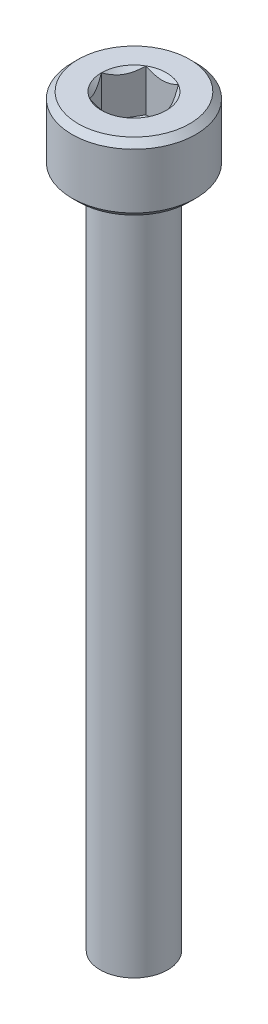
ISO-10303-21;
HEADER;
FILE_DESCRIPTION(('STEP AP214'),'2;1');
FILE_NAME('part.step','',(''),(''),'','','');
FILE_SCHEMA(('AUTOMOTIVE_DESIGN { 1 0 10303 214 1 1 1 1 }'));
ENDSEC;
DATA;
#1=APPLICATION_CONTEXT('core data for automotive mechanical design processes');
#2=APPLICATION_PROTOCOL_DEFINITION('international standard','automotive_design',2000,#1);
#3=PRODUCT_CONTEXT('',#1,'mechanical');
#4=PRODUCT('Part','Part','',(#3));
#5=PRODUCT_RELATED_PRODUCT_CATEGORY('part','',(#4));
#6=PRODUCT_DEFINITION_FORMATION('','',#4);
#7=PRODUCT_DEFINITION_CONTEXT('part definition',#1,'design');
#8=PRODUCT_DEFINITION('design','',#6,#7);
#9=PRODUCT_DEFINITION_SHAPE('','',#8);
#10=(LENGTH_UNIT() NAMED_UNIT(*) SI_UNIT(.MILLI.,.METRE.));
#11=(NAMED_UNIT(*) PLANE_ANGLE_UNIT() SI_UNIT($,.RADIAN.));
#12=(NAMED_UNIT(*) SI_UNIT($,.STERADIAN.) SOLID_ANGLE_UNIT());
#13=UNCERTAINTY_MEASURE_WITH_UNIT(LENGTH_MEASURE(1.E-05),#10,'distance_accuracy_value','');
#14=(GEOMETRIC_REPRESENTATION_CONTEXT(3) GLOBAL_UNCERTAINTY_ASSIGNED_CONTEXT((#13)) GLOBAL_UNIT_ASSIGNED_CONTEXT((#10,
#11,#12)) REPRESENTATION_CONTEXT('',''));
#15=CARTESIAN_POINT('',(0.,0.,0.));
#16=DIRECTION('',(0.,0.,1.));
#17=DIRECTION('',(1.,0.,0.));
#18=AXIS2_PLACEMENT_3D('',#15,#16,#17);
#19=CARTESIAN_POINT('',(0.,3.,0.));
#20=DIRECTION('',(0.,-1.,0.));
#21=DIRECTION('',(0.,0.,-1.));
#22=AXIS2_PLACEMENT_3D('',#19,#20,#21);
#23=CYLINDRICAL_SURFACE('',#22,2.75);
#24=CARTESIAN_POINT('',(0.,0.275000000000001,0.));
#25=DIRECTION('',(0.,1.,0.));
#26=DIRECTION('',(0.,0.,1.));
#27=AXIS2_PLACEMENT_3D('',#24,#25,#26);
#28=CIRCLE('',#27,2.75);
#29=CARTESIAN_POINT('',(0.,0.275000000000001,2.75));
#30=VERTEX_POINT('',#29);
#31=EDGE_CURVE('E227',#30,#30,#28,.T.);
#32=ORIENTED_EDGE('',*,*,#31,.T.);
#33=EDGE_LOOP('',(#32));
#34=FACE_BOUND('',#33,.T.);
#35=CARTESIAN_POINT('',(0.,2.725,0.));
#36=DIRECTION('',(0.,1.,0.));
#37=DIRECTION('',(0.,0.,1.));
#38=AXIS2_PLACEMENT_3D('',#35,#36,#37);
#39=CIRCLE('',#38,2.75);
#40=CARTESIAN_POINT('',(0.,2.725,2.75));
#41=VERTEX_POINT('',#40);
#42=EDGE_CURVE('E104',#41,#41,#39,.F.);
#43=ORIENTED_EDGE('',*,*,#42,.T.);
#44=EDGE_LOOP('',(#43));
#45=FACE_BOUND('',#44,.T.);
#46=ADVANCED_FACE('F32',(#34,#45),#23,.T.);
#47=CARTESIAN_POINT('',(0.,3.,0.));
#48=DIRECTION('',(0.,1.,0.));
#49=DIRECTION('',(0.,0.,1.));
#50=AXIS2_PLACEMENT_3D('',#47,#48,#49);
#51=PLANE('',#50);
#52=CARTESIAN_POINT('',(0.,3.,0.));
#53=DIRECTION('',(0.,1.,0.));
#54=DIRECTION('',(0.,0.,1.));
#55=AXIS2_PLACEMENT_3D('',#52,#53,#54);
#56=CIRCLE('',#55,2.475);
#57=CARTESIAN_POINT('',(0.,3.,2.475));
#58=VERTEX_POINT('',#57);
#59=EDGE_CURVE('E36',#58,#58,#56,.T.);
#60=ORIENTED_EDGE('',*,*,#59,.T.);
#61=EDGE_LOOP('',(#60));
#62=FACE_BOUND('',#61,.T.);
#63=CARTESIAN_POINT('',(0.,3.,0.));
#64=DIRECTION('',(0.,1.,0.));
#65=DIRECTION('',(0.,0.,1.));
#66=AXIS2_PLACEMENT_3D('',#63,#64,#65);
#67=CIRCLE('',#66,1.44337567297406);
#68=CARTESIAN_POINT('',(0.721687836487033,3.,1.25));
#69=VERTEX_POINT('',#68);
#70=CARTESIAN_POINT('',(1.44337567297406,3.,0.));
#71=VERTEX_POINT('',#70);
#72=EDGE_CURVE('E47',#69,#71,#67,.T.);
#73=ORIENTED_EDGE('',*,*,#72,.F.);
#74=CARTESIAN_POINT('',(-0.721687836487033,3.,1.25));
#75=VERTEX_POINT('',#74);
#76=EDGE_CURVE('E54',#75,#69,#67,.T.);
#77=ORIENTED_EDGE('',*,*,#76,.F.);
#78=CARTESIAN_POINT('',(-1.44337567297406,3.,0.));
#79=VERTEX_POINT('',#78);
#80=EDGE_CURVE('E127',#79,#75,#67,.T.);
#81=ORIENTED_EDGE('',*,*,#80,.F.);
#82=CARTESIAN_POINT('',(-0.721687836487033,3.,-1.25));
#83=VERTEX_POINT('',#82);
#84=EDGE_CURVE('E126',#83,#79,#67,.T.);
#85=ORIENTED_EDGE('',*,*,#84,.F.);
#86=CARTESIAN_POINT('',(0.721687836487032,3.,-1.25));
#87=VERTEX_POINT('',#86);
#88=EDGE_CURVE('E94',#87,#83,#67,.T.);
#89=ORIENTED_EDGE('',*,*,#88,.F.);
#90=EDGE_CURVE('E86',#71,#87,#67,.T.);
#91=ORIENTED_EDGE('',*,*,#90,.F.);
#92=EDGE_LOOP('',(#73,#77,#81,#85,#89,#91));
#93=FACE_BOUND('',#92,.T.);
#94=ADVANCED_FACE('F124',(#62,#93),#51,.T.);
#95=CARTESIAN_POINT('',(0.,0.,0.));
#96=DIRECTION('',(0.,1.,0.));
#97=DIRECTION('',(0.,0.,1.));
#98=AXIS2_PLACEMENT_3D('',#95,#96,#97);
#99=PLANE('',#98);
#100=CARTESIAN_POINT('',(0.,0.,0.));
#101=DIRECTION('',(0.,-1.,0.));
#102=DIRECTION('',(0.,0.,-1.));
#103=AXIS2_PLACEMENT_3D('',#100,#101,#102);
#104=CIRCLE('',#103,1.5);
#105=CARTESIAN_POINT('',(0.,0.,-1.5));
#106=VERTEX_POINT('',#105);
#107=EDGE_CURVE('E11',#106,#106,#104,.T.);
#108=ORIENTED_EDGE('',*,*,#107,.F.);
#109=EDGE_LOOP('',(#108));
#110=FACE_BOUND('',#109,.T.);
#111=CARTESIAN_POINT('',(0.,0.,0.));
#112=DIRECTION('',(0.,1.,0.));
#113=DIRECTION('',(0.,0.,1.));
#114=AXIS2_PLACEMENT_3D('',#111,#112,#113);
#115=CIRCLE('',#114,2.475);
#116=CARTESIAN_POINT('',(0.,0.,2.475));
#117=VERTEX_POINT('',#116);
#118=EDGE_CURVE('E225',#117,#117,#115,.F.);
#119=ORIENTED_EDGE('',*,*,#118,.T.);
#120=EDGE_LOOP('',(#119));
#121=FACE_BOUND('',#120,.T.);
#122=ADVANCED_FACE('F208',(#110,#121),#99,.F.);
#123=CARTESIAN_POINT('',(0.,3.,0.));
#124=DIRECTION('',(0.,1.,0.));
#125=DIRECTION('',(0.,0.,1.));
#126=AXIS2_PLACEMENT_3D('',#123,#124,#125);
#127=CONICAL_SURFACE('',#126,1.44337567297406,0.78539816339745);
#128=ORIENTED_EDGE('',*,*,#88,.T.);
#129=CARTESIAN_POINT('',(-1.43934010808077,3.46298209689233,-1.25));
#130=CARTESIAN_POINT('',(-1.40429313005659,3.43652492263289,-1.25));
#131=CARTESIAN_POINT('',(-1.36905087135599,3.41032716035428,-1.25));
#132=CARTESIAN_POINT('',(-1.29809650706311,3.35855757183958,-1.25));
#133=CARTESIAN_POINT('',(-1.26238428576495,3.33298590435629,-1.25));
#134=CARTESIAN_POINT('',(-1.15390111792708,3.25700599368946,-1.25));
#135=CARTESIAN_POINT('',(-1.08031646726264,3.20774028618957,-1.25));
#136=CARTESIAN_POINT('',(-0.926012322755095,3.11102583026313,-1.25));
#137=CARTESIAN_POINT('',(-0.845125318656146,3.0638412989418,-1.25));
#138=CARTESIAN_POINT('',(-0.679311174076602,2.97753073439041,-1.25));
#139=CARTESIAN_POINT('',(-0.594398891026688,2.9383775346269,-1.25));
#140=CARTESIAN_POINT('',(-0.466944812460741,2.89047722368829,-1.25));
#141=CARTESIAN_POINT('',(-0.426289985812822,2.87672948978634,-1.25));
#142=CARTESIAN_POINT('',(-0.343998850091268,2.85249792745054,-1.25));
#143=CARTESIAN_POINT('',(-0.302362473614962,2.84201432386977,-1.25));
#144=CARTESIAN_POINT('',(-0.219052696285666,2.8250301617483,-1.25));
#145=CARTESIAN_POINT('',(-0.1773934284745,2.81846136047137,-1.25));
#146=CARTESIAN_POINT('',(-0.0936293693401924,2.80943505345776,-1.25));
#147=CARTESIAN_POINT('',(-0.0515246558543963,2.80697684099727,-1.25));
#148=CARTESIAN_POINT('',(0.0311890576306314,2.80635406201328,-1.25));
#149=CARTESIAN_POINT('',(0.0717969625499302,2.80803711684625,-1.25));
#150=CARTESIAN_POINT('',(0.152668636885197,2.81526827059791,-1.25));
#151=CARTESIAN_POINT('',(0.192932338835358,2.82081711041311,-1.25));
#152=CARTESIAN_POINT('',(0.273499879165295,2.83557103646495,-1.25));
#153=CARTESIAN_POINT('',(0.313792180618511,2.8448381759641,-1.25));
#154=CARTESIAN_POINT('',(0.393496413911457,2.86653617845735,-1.25));
#155=CARTESIAN_POINT('',(0.432908419115059,2.87896677673064,-1.25));
#156=CARTESIAN_POINT('',(0.556992735862298,2.92277935293144,-1.25));
#157=CARTESIAN_POINT('',(0.639898924666085,2.95915107287596,-1.25));
#158=CARTESIAN_POINT('',(0.801816555499701,3.04001916217833,-1.25));
#159=CARTESIAN_POINT('',(0.880812666325045,3.08454472091199,-1.25));
#160=CARTESIAN_POINT('',(1.0317856127975,3.17640487666662,-1.25));
#161=CARTESIAN_POINT('',(1.10391618485086,3.22348993391625,-1.25));
#162=CARTESIAN_POINT('',(1.21018606043311,3.29627856159854,-1.25));
#163=CARTESIAN_POINT('',(1.24515069969379,3.32079808539336,-1.25));
#164=CARTESIAN_POINT('',(1.31460220852736,3.37048563676568,-1.25));
#165=CARTESIAN_POINT('',(1.34908920596618,3.39565348541552,-1.25));
#166=CARTESIAN_POINT('',(1.38337731682912,3.42109014884121,-1.25));
#167=B_SPLINE_CURVE_WITH_KNOTS('',3,(#129,#130,#131,#132,#133,#134,#135,#136,#137,#138,#139,
#140,#141,#142,#143,#144,#145,#146,#147,#148,#149,#150,#151,#152,#153,#154,#155,#156,#157,#158,
#159,#160,#161,#162,#163,#164,#165,#166),.UNSPECIFIED.,.F.,.F.,(4,2,2,2,2,2,2,2,2,2,2,2,2,2,2,2,
2,2,4),(0.,0.131732960381448,0.263498984161645,0.529042014455825,0.809741926134617,
1.08947609717225,1.21811634272576,1.346765447839,1.47310084517844,1.59941451973784,
1.72115042167849,1.84290966131735,1.96679153905341,2.09066305366039,2.36146692896009,
2.63325989198491,2.89154668212279,3.01965734507713,3.14773302245628),.UNSPECIFIED.);
#168=EDGE_CURVE('E99',#87,#83,#167,.F.);
#169=ORIENTED_EDGE('',*,*,#168,.F.);
#170=EDGE_LOOP('',(#128,#169));
#171=FACE_BOUND('',#170,.T.);
#172=ADVANCED_FACE('F100',(#171),#127,.F.);
#173=ORIENTED_EDGE('',*,*,#84,.T.);
#174=CARTESIAN_POINT('',(-0.721572366433195,3.00011548390914,-1.2502));
#175=CARTESIAN_POINT('',(-0.746384090710444,2.9753216680551,-1.20722483292841));
#176=CARTESIAN_POINT('',(-0.771610739653664,2.95198373441868,-1.16353099525405));
#177=CARTESIAN_POINT('',(-0.823050873919155,2.90925200408454,-1.07443406915806));
#178=CARTESIAN_POINT('',(-0.849269254648333,2.88988199236041,-1.02902250164294));
#179=CARTESIAN_POINT('',(-0.902137405038635,2.85670048341348,-0.937452179064741));
#180=CARTESIAN_POINT('',(-0.928773701756387,2.84280555905266,-0.891316759824115));
#181=CARTESIAN_POINT('',(-0.982632884076012,2.82139728216064,-0.798029919592408));
#182=CARTESIAN_POINT('',(-1.00985412292348,2.81386794156679,-0.750881350863621));
#183=CARTESIAN_POINT('',(-1.05676666578643,2.8070744980507,-0.669626443112748));
#184=CARTESIAN_POINT('',(-1.07639733689152,2.80606855910435,-0.63562512337206));
#185=CARTESIAN_POINT('',(-1.11562418145499,2.80776141491132,-0.567682235567523));
#186=CARTESIAN_POINT('',(-1.1352203463451,2.81046102721554,-0.533740682344343));
#187=CARTESIAN_POINT('',(-1.1742235548576,2.81940893031638,-0.466185143542501));
#188=CARTESIAN_POINT('',(-1.19363040521233,2.82566052589971,-0.432571492713226));
#189=CARTESIAN_POINT('',(-1.23212011385119,2.8413756814139,-0.365905361782188));
#190=CARTESIAN_POINT('',(-1.2512028293628,2.85084062008746,-0.332853128969705));
#191=CARTESIAN_POINT('',(-1.30007715810653,2.87893139068759,-0.248200308399736));
#192=CARTESIAN_POINT('',(-1.32956058931202,2.8996701574522,-0.197133507570362));
#193=CARTESIAN_POINT('',(-1.38737318998519,2.94638713467148,-0.0969991458867452));
#194=CARTESIAN_POINT('',(-1.41570576386268,2.97234829594677,-0.0479256884217304));
#195=CARTESIAN_POINT('',(-1.4434911430279,3.00011548390914,0.000200000000000358));
#196=B_SPLINE_CURVE_WITH_KNOTS('',3,(#174,#175,#176,#177,#178,#179,#180,#181,#182,#183,#184,
#185,#186,#187,#188,#189,#190,#191,#192,#193,#194,#195),.UNSPECIFIED.,.F.,.F.,(4,2,2,2,2,2,2,2,
2,2,4),(0.,0.166533409618303,0.334037607289761,0.498880396489697,0.663307919240274,
0.780963963458826,0.898645970148452,1.01643764860773,1.13427993171549,1.32148652032141,
1.50809158792574),.UNSPECIFIED.);
#197=EDGE_CURVE('E129',#83,#79,#196,.T.);
#198=ORIENTED_EDGE('',*,*,#197,.F.);
#199=EDGE_LOOP('',(#173,#198));
#200=FACE_BOUND('',#199,.T.);
#201=ADVANCED_FACE('F240',(#200),#127,.F.);
#202=ORIENTED_EDGE('',*,*,#80,.T.);
#203=CARTESIAN_POINT('',(-1.4434911430279,3.00011548390914,-0.000199999999999785));
#204=CARTESIAN_POINT('',(-1.41867941875065,2.9753216680551,0.0427751670715869));
#205=CARTESIAN_POINT('',(-1.39345276980743,2.95198373441868,0.0864690047459481));
#206=CARTESIAN_POINT('',(-1.34201263554194,2.90925200408454,0.175565930841942));
#207=CARTESIAN_POINT('',(-1.31579425481276,2.88988199236041,0.220977498357064));
#208=CARTESIAN_POINT('',(-1.26292610442246,2.85670048341348,0.31254782093526));
#209=CARTESIAN_POINT('',(-1.23628980770471,2.84280555905266,0.358683240175886));
#210=CARTESIAN_POINT('',(-1.18243062538508,2.82139728216064,0.451970080407593));
#211=CARTESIAN_POINT('',(-1.15520938653761,2.81386794156679,0.49911864913638));
#212=CARTESIAN_POINT('',(-1.10829684367467,2.8070744980507,0.580373556887253));
#213=CARTESIAN_POINT('',(-1.08866617256958,2.80606855910435,0.614374876627941));
#214=CARTESIAN_POINT('',(-1.04943932800611,2.80776141491132,0.682317764432478));
#215=CARTESIAN_POINT('',(-1.02984316311599,2.81046102721554,0.716259317655658));
#216=CARTESIAN_POINT('',(-0.990839954603499,2.81940893031638,0.7838148564575));
#217=CARTESIAN_POINT('',(-0.971433104248771,2.82566052589971,0.817428507286775));
#218=CARTESIAN_POINT('',(-0.932943395609905,2.8413756814139,0.884094638217813));
#219=CARTESIAN_POINT('',(-0.9138606800983,2.85084062008746,0.917146871030296));
#220=CARTESIAN_POINT('',(-0.864986351354568,2.87893139068759,1.00179969160026));
#221=CARTESIAN_POINT('',(-0.835502920149076,2.8996701574522,1.05286649242964));
#222=CARTESIAN_POINT('',(-0.777690319475909,2.94638713467148,1.15300085411325));
#223=CARTESIAN_POINT('',(-0.749357745598417,2.97234829594677,1.20207431157827));
#224=CARTESIAN_POINT('',(-0.721572366433195,3.00011548390914,1.2502));
#225=B_SPLINE_CURVE_WITH_KNOTS('',3,(#203,#204,#205,#206,#207,#208,#209,#210,#211,#212,#213,
#214,#215,#216,#217,#218,#219,#220,#221,#222,#223,#224),.UNSPECIFIED.,.F.,.F.,(4,2,2,2,2,2,2,2,
2,2,4),(0.,0.166533409618303,0.334037607289761,0.498880396489698,0.663307919240275,
0.780963963458827,0.898645970148453,1.01643764860773,1.1342799317155,1.32148652032141,
1.50809158792573),.UNSPECIFIED.);
#226=EDGE_CURVE('E139',#79,#75,#225,.T.);
#227=ORIENTED_EDGE('',*,*,#226,.F.);
#228=EDGE_LOOP('',(#202,#227));
#229=FACE_BOUND('',#228,.T.);
#230=ADVANCED_FACE('F256',(#229),#127,.F.);
#231=ORIENTED_EDGE('',*,*,#76,.T.);
#232=CARTESIAN_POINT('',(-1.43934010808077,3.46298209689233,1.25));
#233=CARTESIAN_POINT('',(-1.40429313005659,3.43652492263289,1.25));
#234=CARTESIAN_POINT('',(-1.36905087135599,3.41032716035428,1.25));
#235=CARTESIAN_POINT('',(-1.29809650706311,3.35855757183958,1.25));
#236=CARTESIAN_POINT('',(-1.26238428576495,3.33298590435629,1.25));
#237=CARTESIAN_POINT('',(-1.15390111792708,3.25700599368946,1.25));
#238=CARTESIAN_POINT('',(-1.08031646726264,3.20774028618957,1.25));
#239=CARTESIAN_POINT('',(-0.926012322755096,3.11102583026313,1.25));
#240=CARTESIAN_POINT('',(-0.845125318656147,3.0638412989418,1.25));
#241=CARTESIAN_POINT('',(-0.679311174076603,2.97753073439041,1.25));
#242=CARTESIAN_POINT('',(-0.594398891026688,2.9383775346269,1.25));
#243=CARTESIAN_POINT('',(-0.46694481246074,2.89047722368829,1.25));
#244=CARTESIAN_POINT('',(-0.426289985812822,2.87672948978634,1.25));
#245=CARTESIAN_POINT('',(-0.343998850091268,2.85249792745054,1.25));
#246=CARTESIAN_POINT('',(-0.302362473614962,2.84201432386977,1.25));
#247=CARTESIAN_POINT('',(-0.219052696285665,2.8250301617483,1.25));
#248=CARTESIAN_POINT('',(-0.1773934284745,2.81846136047137,1.25));
#249=CARTESIAN_POINT('',(-0.0936293693401921,2.80943505345776,1.25));
#250=CARTESIAN_POINT('',(-0.051524655854396,2.80697684099727,1.25));
#251=CARTESIAN_POINT('',(0.0311890576306315,2.80635406201328,1.25));
#252=CARTESIAN_POINT('',(0.0717969625499303,2.80803711684625,1.25));
#253=CARTESIAN_POINT('',(0.152668636885197,2.81526827059791,1.25));
#254=CARTESIAN_POINT('',(0.192932338835358,2.82081711041311,1.25));
#255=CARTESIAN_POINT('',(0.273499879165295,2.83557103646495,1.25));
#256=CARTESIAN_POINT('',(0.313792180618511,2.8448381759641,1.25));
#257=CARTESIAN_POINT('',(0.393496413911457,2.86653617845735,1.25));
#258=CARTESIAN_POINT('',(0.432908419115059,2.87896677673064,1.25));
#259=CARTESIAN_POINT('',(0.556992735862298,2.92277935293144,1.25));
#260=CARTESIAN_POINT('',(0.639898924666085,2.95915107287595,1.25));
#261=CARTESIAN_POINT('',(0.801816555499701,3.04001916217833,1.25));
#262=CARTESIAN_POINT('',(0.880812666325044,3.08454472091198,1.25));
#263=CARTESIAN_POINT('',(1.0317856127975,3.17640487666662,1.25));
#264=CARTESIAN_POINT('',(1.10391618485086,3.22348993391625,1.25));
#265=CARTESIAN_POINT('',(1.2101860604331,3.29627856159854,1.25));
#266=CARTESIAN_POINT('',(1.24515069969379,3.32079808539336,1.25));
#267=CARTESIAN_POINT('',(1.31460220852736,3.37048563676568,1.25));
#268=CARTESIAN_POINT('',(1.34908920596618,3.39565348541552,1.25));
#269=CARTESIAN_POINT('',(1.38337731682911,3.42109014884121,1.25));
#270=B_SPLINE_CURVE_WITH_KNOTS('',3,(#232,#233,#234,#235,#236,#237,#238,#239,#240,#241,#242,
#243,#244,#245,#246,#247,#248,#249,#250,#251,#252,#253,#254,#255,#256,#257,#258,#259,#260,#261,
#262,#263,#264,#265,#266,#267,#268,#269),.UNSPECIFIED.,.F.,.F.,(4,2,2,2,2,2,2,2,2,2,2,2,2,2,2,2,
2,2,4),(0.,0.131732960381448,0.263498984161645,0.529042014455826,0.809741926134619,
1.08947609717225,1.21811634272577,1.34676544783901,1.47310084517844,1.59941451973785,
1.7211504216785,1.84290966131735,1.96679153905342,2.09066305366039,2.36146692896009,
2.63325989198491,2.89154668212279,3.01965734507713,3.14773302245628),.UNSPECIFIED.);
#271=EDGE_CURVE('E168',#75,#69,#270,.T.);
#272=ORIENTED_EDGE('',*,*,#271,.F.);
#273=EDGE_LOOP('',(#231,#272));
#274=FACE_BOUND('',#273,.T.);
#275=ADVANCED_FACE('F286',(#274),#127,.F.);
#276=ORIENTED_EDGE('',*,*,#72,.T.);
#277=CARTESIAN_POINT('',(0.721572366433194,3.00011548390914,1.2502));
#278=CARTESIAN_POINT('',(0.746384090710444,2.9753216680551,1.20722483292841));
#279=CARTESIAN_POINT('',(0.771610739653664,2.95198373441868,1.16353099525405));
#280=CARTESIAN_POINT('',(0.823050873919154,2.90925200408454,1.07443406915806));
#281=CARTESIAN_POINT('',(0.849269254648333,2.88988199236041,1.02902250164294));
#282=CARTESIAN_POINT('',(0.902137405038635,2.85670048341348,0.93745217906474));
#283=CARTESIAN_POINT('',(0.928773701756386,2.84280555905266,0.891316759824115));
#284=CARTESIAN_POINT('',(0.982632884076012,2.82139728216064,0.798029919592408));
#285=CARTESIAN_POINT('',(1.00985412292348,2.81386794156679,0.750881350863621));
#286=CARTESIAN_POINT('',(1.05676666578643,2.8070744980507,0.669626443112748));
#287=CARTESIAN_POINT('',(1.07639733689152,2.80606855910435,0.63562512337206));
#288=CARTESIAN_POINT('',(1.11562418145499,2.80776141491132,0.567682235567523));
#289=CARTESIAN_POINT('',(1.1352203463451,2.81046102721554,0.533740682344343));
#290=CARTESIAN_POINT('',(1.1742235548576,2.81940893031638,0.466185143542501));
#291=CARTESIAN_POINT('',(1.19363040521232,2.8256605258997,0.432571492713226));
#292=CARTESIAN_POINT('',(1.23212011385119,2.8413756814139,0.365905361782188));
#293=CARTESIAN_POINT('',(1.2512028293628,2.85084062008746,0.332853128969705));
#294=CARTESIAN_POINT('',(1.30007715810653,2.87893139068759,0.248200308399736));
#295=CARTESIAN_POINT('',(1.32956058931202,2.8996701574522,0.197133507570362));
#296=CARTESIAN_POINT('',(1.38737318998519,2.94638713467148,0.096999145886745));
#297=CARTESIAN_POINT('',(1.41570576386268,2.97234829594677,0.04792568842173));
#298=CARTESIAN_POINT('',(1.4434911430279,3.00011548390914,-0.000200000000000782));
#299=B_SPLINE_CURVE_WITH_KNOTS('',3,(#277,#278,#279,#280,#281,#282,#283,#284,#285,#286,#287,
#288,#289,#290,#291,#292,#293,#294,#295,#296,#297,#298),.UNSPECIFIED.,.F.,.F.,(4,2,2,2,2,2,2,2,
2,2,4),(0.,0.166533409618303,0.334037607289761,0.498880396489697,0.663307919240274,
0.780963963458826,0.898645970148452,1.01643764860773,1.13427993171549,1.32148652032141,
1.50809158792574),.UNSPECIFIED.);
#300=EDGE_CURVE('E114',#69,#71,#299,.T.);
#301=ORIENTED_EDGE('',*,*,#300,.F.);
#302=EDGE_LOOP('',(#276,#301));
#303=FACE_BOUND('',#302,.T.);
#304=ADVANCED_FACE('F154',(#303),#127,.F.);
#305=ORIENTED_EDGE('',*,*,#90,.T.);
#306=CARTESIAN_POINT('',(1.4434911430279,3.00011548390914,0.000199999999999333));
#307=CARTESIAN_POINT('',(1.41867941875065,2.9753216680551,-0.0427751670715874));
#308=CARTESIAN_POINT('',(1.39345276980743,2.95198373441868,-0.0864690047459486));
#309=CARTESIAN_POINT('',(1.34201263554194,2.90925200408454,-0.175565930841942));
#310=CARTESIAN_POINT('',(1.31579425481276,2.88988199236041,-0.220977498357064));
#311=CARTESIAN_POINT('',(1.26292610442246,2.85670048341348,-0.31254782093526));
#312=CARTESIAN_POINT('',(1.23628980770471,2.84280555905266,-0.358683240175886));
#313=CARTESIAN_POINT('',(1.18243062538508,2.82139728216064,-0.451970080407593));
#314=CARTESIAN_POINT('',(1.15520938653761,2.81386794156679,-0.49911864913638));
#315=CARTESIAN_POINT('',(1.10829684367467,2.8070744980507,-0.580373556887252));
#316=CARTESIAN_POINT('',(1.08866617256958,2.80606855910435,-0.614374876627941));
#317=CARTESIAN_POINT('',(1.04943932800611,2.80776141491132,-0.682317764432477));
#318=CARTESIAN_POINT('',(1.02984316311599,2.81046102721554,-0.716259317655657));
#319=CARTESIAN_POINT('',(0.990839954603499,2.81940893031638,-0.783814856457499));
#320=CARTESIAN_POINT('',(0.971433104248771,2.82566052589971,-0.817428507286775));
#321=CARTESIAN_POINT('',(0.932943395609905,2.8413756814139,-0.884094638217813));
#322=CARTESIAN_POINT('',(0.9138606800983,2.85084062008746,-0.917146871030295));
#323=CARTESIAN_POINT('',(0.864986351354567,2.87893139068759,-1.00179969160026));
#324=CARTESIAN_POINT('',(0.835502920149075,2.8996701574522,-1.05286649242964));
#325=CARTESIAN_POINT('',(0.777690319475908,2.94638713467148,-1.15300085411326));
#326=CARTESIAN_POINT('',(0.749357745598416,2.97234829594677,-1.20207431157827));
#327=CARTESIAN_POINT('',(0.721572366433194,3.00011548390914,-1.2502));
#328=B_SPLINE_CURVE_WITH_KNOTS('',3,(#306,#307,#308,#309,#310,#311,#312,#313,#314,#315,#316,
#317,#318,#319,#320,#321,#322,#323,#324,#325,#326,#327),.UNSPECIFIED.,.F.,.F.,(4,2,2,2,2,2,2,2,
2,2,4),(0.,0.166533409618303,0.334037607289761,0.498880396489698,0.663307919240274,
0.780963963458826,0.898645970148452,1.01643764860773,1.13427993171549,1.32148652032141,
1.50809158792574),.UNSPECIFIED.);
#329=EDGE_CURVE('E90',#71,#87,#328,.T.);
#330=ORIENTED_EDGE('',*,*,#329,.F.);
#331=EDGE_LOOP('',(#305,#330));
#332=FACE_BOUND('',#331,.T.);
#333=ADVANCED_FACE('F88',(#332),#127,.F.);
#334=CARTESIAN_POINT('',(0.,1.12,0.));
#335=DIRECTION('',(0.,1.,0.));
#336=DIRECTION('',(0.,0.,1.));
#337=AXIS2_PLACEMENT_3D('',#334,#335,#336);
#338=PLANE('',#337);
#339=DIRECTION('',(-0.5,0.,-0.866025403784438));
#340=VECTOR('',#339,1.);
#341=CARTESIAN_POINT('',(1.44337567297406,1.12,0.));
#342=LINE('',#341,#340);
#343=CARTESIAN_POINT('',(1.44337567297406,1.12,0.));
#344=VERTEX_POINT('',#343);
#345=CARTESIAN_POINT('',(0.721687836487032,1.12,-1.25));
#346=VERTEX_POINT('',#345);
#347=EDGE_CURVE('E113',#344,#346,#342,.T.);
#348=ORIENTED_EDGE('',*,*,#347,.T.);
#349=DIRECTION('',(-1.,0.,0.));
#350=VECTOR('',#349,1.);
#351=CARTESIAN_POINT('',(0.721687836487032,1.12,-1.25));
#352=LINE('',#351,#350);
#353=CARTESIAN_POINT('',(-0.721687836487032,1.12,-1.25));
#354=VERTEX_POINT('',#353);
#355=EDGE_CURVE('E118',#346,#354,#352,.T.);
#356=ORIENTED_EDGE('',*,*,#355,.T.);
#357=DIRECTION('',(-0.5,0.,0.866025403784439));
#358=VECTOR('',#357,1.);
#359=CARTESIAN_POINT('',(-0.721687836487032,1.12,-1.25));
#360=LINE('',#359,#358);
#361=CARTESIAN_POINT('',(-1.44337567297406,1.12,0.));
#362=VERTEX_POINT('',#361);
#363=EDGE_CURVE('E280',#354,#362,#360,.T.);
#364=ORIENTED_EDGE('',*,*,#363,.T.);
#365=DIRECTION('',(0.5,0.,0.866025403784439));
#366=VECTOR('',#365,1.);
#367=CARTESIAN_POINT('',(-1.44337567297406,1.12,0.));
#368=LINE('',#367,#366);
#369=CARTESIAN_POINT('',(-0.721687836487033,1.12,1.25));
#370=VERTEX_POINT('',#369);
#371=EDGE_CURVE('E263',#362,#370,#368,.T.);
#372=ORIENTED_EDGE('',*,*,#371,.T.);
#373=DIRECTION('',(1.,0.,0.));
#374=VECTOR('',#373,1.);
#375=CARTESIAN_POINT('',(-0.721687836487033,1.12,1.25));
#376=LINE('',#375,#374);
#377=CARTESIAN_POINT('',(0.721687836487032,1.12,1.25));
#378=VERTEX_POINT('',#377);
#379=EDGE_CURVE('E276',#370,#378,#376,.T.);
#380=ORIENTED_EDGE('',*,*,#379,.T.);
#381=DIRECTION('',(0.5,0.,-0.866025403784439));
#382=VECTOR('',#381,1.);
#383=CARTESIAN_POINT('',(0.721687836487032,1.12,1.25));
#384=LINE('',#383,#382);
#385=EDGE_CURVE('E121',#378,#344,#384,.T.);
#386=ORIENTED_EDGE('',*,*,#385,.T.);
#387=EDGE_LOOP('',(#348,#356,#364,#372,#380,#386));
#388=FACE_BOUND('',#387,.T.);
#389=ADVANCED_FACE('F153',(#388),#338,.T.);
#390=CARTESIAN_POINT('',(0.721687836487032,1.12,-1.25));
#391=DIRECTION('',(0.,0.,-1.));
#392=DIRECTION('',(-1.,0.,0.));
#393=AXIS2_PLACEMENT_3D('',#390,#391,#392);
#394=PLANE('',#393);
#395=DIRECTION('',(0.,1.,0.));
#396=VECTOR('',#395,1.);
#397=CARTESIAN_POINT('',(0.721687836487032,1.12,-1.25));
#398=LINE('',#397,#396);
#399=EDGE_CURVE('E111',#346,#87,#398,.T.);
#400=ORIENTED_EDGE('',*,*,#399,.T.);
#401=ORIENTED_EDGE('',*,*,#168,.T.);
#402=DIRECTION('',(0.,1.,0.));
#403=VECTOR('',#402,1.);
#404=CARTESIAN_POINT('',(-0.721687836487032,1.12,-1.25));
#405=LINE('',#404,#403);
#406=EDGE_CURVE('E120',#354,#83,#405,.T.);
#407=ORIENTED_EDGE('',*,*,#406,.F.);
#408=ORIENTED_EDGE('',*,*,#355,.F.);
#409=EDGE_LOOP('',(#400,#401,#407,#408));
#410=FACE_BOUND('',#409,.T.);
#411=ADVANCED_FACE('F116',(#410),#394,.F.);
#412=CARTESIAN_POINT('',(-0.721687836487032,1.12,-1.25));
#413=DIRECTION('',(-0.866025403784439,0.,-0.5));
#414=DIRECTION('',(-0.5,0.,0.866025403784439));
#415=AXIS2_PLACEMENT_3D('',#412,#413,#414);
#416=PLANE('',#415);
#417=ORIENTED_EDGE('',*,*,#406,.T.);
#418=ORIENTED_EDGE('',*,*,#197,.T.);
#419=DIRECTION('',(0.,1.,0.));
#420=VECTOR('',#419,1.);
#421=CARTESIAN_POINT('',(-1.44337567297406,1.12,0.));
#422=LINE('',#421,#420);
#423=EDGE_CURVE('E259',#362,#79,#422,.T.);
#424=ORIENTED_EDGE('',*,*,#423,.F.);
#425=ORIENTED_EDGE('',*,*,#363,.F.);
#426=EDGE_LOOP('',(#417,#418,#424,#425));
#427=FACE_BOUND('',#426,.T.);
#428=ADVANCED_FACE('F146',(#427),#416,.F.);
#429=CARTESIAN_POINT('',(-1.44337567297406,1.12,0.));
#430=DIRECTION('',(-0.866025403784439,0.,0.5));
#431=DIRECTION('',(0.5,0.,0.866025403784439));
#432=AXIS2_PLACEMENT_3D('',#429,#430,#431);
#433=PLANE('',#432);
#434=ORIENTED_EDGE('',*,*,#423,.T.);
#435=ORIENTED_EDGE('',*,*,#226,.T.);
#436=DIRECTION('',(0.,1.,0.));
#437=VECTOR('',#436,1.);
#438=CARTESIAN_POINT('',(-0.721687836487033,1.12,1.25));
#439=LINE('',#438,#437);
#440=EDGE_CURVE('E265',#370,#75,#439,.T.);
#441=ORIENTED_EDGE('',*,*,#440,.F.);
#442=ORIENTED_EDGE('',*,*,#371,.F.);
#443=EDGE_LOOP('',(#434,#435,#441,#442));
#444=FACE_BOUND('',#443,.T.);
#445=ADVANCED_FACE('F192',(#444),#433,.F.);
#446=CARTESIAN_POINT('',(-0.721687836487033,1.12,1.25));
#447=DIRECTION('',(0.,0.,1.));
#448=DIRECTION('',(1.,0.,0.));
#449=AXIS2_PLACEMENT_3D('',#446,#447,#448);
#450=PLANE('',#449);
#451=ORIENTED_EDGE('',*,*,#440,.T.);
#452=ORIENTED_EDGE('',*,*,#271,.T.);
#453=DIRECTION('',(0.,1.,0.));
#454=VECTOR('',#453,1.);
#455=CARTESIAN_POINT('',(0.721687836487032,1.12,1.25));
#456=LINE('',#455,#454);
#457=EDGE_CURVE('E267',#378,#69,#456,.T.);
#458=ORIENTED_EDGE('',*,*,#457,.F.);
#459=ORIENTED_EDGE('',*,*,#379,.F.);
#460=EDGE_LOOP('',(#451,#452,#458,#459));
#461=FACE_BOUND('',#460,.T.);
#462=ADVANCED_FACE('F188',(#461),#450,.F.);
#463=CARTESIAN_POINT('',(0.721687836487032,1.12,1.25));
#464=DIRECTION('',(0.866025403784439,0.,0.5));
#465=DIRECTION('',(0.5,0.,-0.866025403784439));
#466=AXIS2_PLACEMENT_3D('',#463,#464,#465);
#467=PLANE('',#466);
#468=ORIENTED_EDGE('',*,*,#457,.T.);
#469=ORIENTED_EDGE('',*,*,#300,.T.);
#470=DIRECTION('',(0.,1.,0.));
#471=VECTOR('',#470,1.);
#472=CARTESIAN_POINT('',(1.44337567297406,1.12,0.));
#473=LINE('',#472,#471);
#474=EDGE_CURVE('E105',#344,#71,#473,.T.);
#475=ORIENTED_EDGE('',*,*,#474,.F.);
#476=ORIENTED_EDGE('',*,*,#385,.F.);
#477=EDGE_LOOP('',(#468,#469,#475,#476));
#478=FACE_BOUND('',#477,.T.);
#479=ADVANCED_FACE('F185',(#478),#467,.F.);
#480=CARTESIAN_POINT('',(1.44337567297406,1.12,0.));
#481=DIRECTION('',(0.866025403784438,0.,-0.5));
#482=DIRECTION('',(-0.5,0.,-0.866025403784439));
#483=AXIS2_PLACEMENT_3D('',#480,#481,#482);
#484=PLANE('',#483);
#485=ORIENTED_EDGE('',*,*,#474,.T.);
#486=ORIENTED_EDGE('',*,*,#329,.T.);
#487=ORIENTED_EDGE('',*,*,#399,.F.);
#488=ORIENTED_EDGE('',*,*,#347,.F.);
#489=EDGE_LOOP('',(#485,#486,#487,#488));
#490=FACE_BOUND('',#489,.T.);
#491=ADVANCED_FACE('F109',(#490),#484,.F.);
#492=CARTESIAN_POINT('',(0.,0.275000000000001,0.));
#493=DIRECTION('',(0.,1.,0.));
#494=DIRECTION('',(0.,0.,1.));
#495=AXIS2_PLACEMENT_3D('',#492,#493,#494);
#496=CONICAL_SURFACE('',#495,2.75,0.785398163397451);
#497=ORIENTED_EDGE('',*,*,#118,.F.);
#498=EDGE_LOOP('',(#497));
#499=FACE_BOUND('',#498,.T.);
#500=ORIENTED_EDGE('',*,*,#31,.F.);
#501=EDGE_LOOP('',(#500));
#502=FACE_BOUND('',#501,.T.);
#503=ADVANCED_FACE('F214',(#499,#502),#496,.T.);
#504=CARTESIAN_POINT('',(0.,3.,0.));
#505=DIRECTION('',(0.,-1.,0.));
#506=DIRECTION('',(0.,0.,-1.));
#507=AXIS2_PLACEMENT_3D('',#504,#505,#506);
#508=CONICAL_SURFACE('',#507,2.475,0.785398163397447);
#509=ORIENTED_EDGE('',*,*,#42,.F.);
#510=EDGE_LOOP('',(#509));
#511=FACE_BOUND('',#510,.T.);
#512=ORIENTED_EDGE('',*,*,#59,.F.);
#513=EDGE_LOOP('',(#512));
#514=FACE_BOUND('',#513,.T.);
#515=ADVANCED_FACE('F34',(#511,#514),#508,.T.);
#516=CARTESIAN_POINT('',(0.,-30.,0.));
#517=DIRECTION('',(0.,1.,0.));
#518=DIRECTION('',(0.,0.,1.));
#519=AXIS2_PLACEMENT_3D('',#516,#517,#518);
#520=CYLINDRICAL_SURFACE('',#519,1.5);
#521=CARTESIAN_POINT('',(0.,-30.,0.));
#522=DIRECTION('',(0.,-1.,0.));
#523=DIRECTION('',(0.,0.,-1.));
#524=AXIS2_PLACEMENT_3D('',#521,#522,#523);
#525=CIRCLE('',#524,1.5);
#526=CARTESIAN_POINT('',(0.,-30.,-1.5));
#527=VERTEX_POINT('',#526);
#528=EDGE_CURVE('E252',#527,#527,#525,.T.);
#529=ORIENTED_EDGE('',*,*,#528,.F.);
#530=EDGE_LOOP('',(#529));
#531=FACE_BOUND('',#530,.T.);
#532=ORIENTED_EDGE('',*,*,#107,.T.);
#533=EDGE_LOOP('',(#532));
#534=FACE_BOUND('',#533,.T.);
#535=ADVANCED_FACE('F155',(#531,#534),#520,.T.);
#536=CARTESIAN_POINT('',(0.,-30.,0.));
#537=DIRECTION('',(0.,-1.,0.));
#538=DIRECTION('',(0.,0.,-1.));
#539=AXIS2_PLACEMENT_3D('',#536,#537,#538);
#540=PLANE('',#539);
#541=ORIENTED_EDGE('',*,*,#528,.T.);
#542=EDGE_LOOP('',(#541));
#543=FACE_BOUND('',#542,.T.);
#544=ADVANCED_FACE('F244',(#543),#540,.T.);
#545=CLOSED_SHELL('',(#46,#94,#122,#172,#201,#230,#275,#304,#333,#389,#411,#428,#445,#462,#479,
#491,#503,#515,#535,#544));
#546=MANIFOLD_SOLID_BREP('B2',#545);
#547=ADVANCED_BREP_SHAPE_REPRESENTATION('',(#18,#546),#14);
#548=SHAPE_DEFINITION_REPRESENTATION(#9,#547);
ENDSEC;
END-ISO-10303-21;
